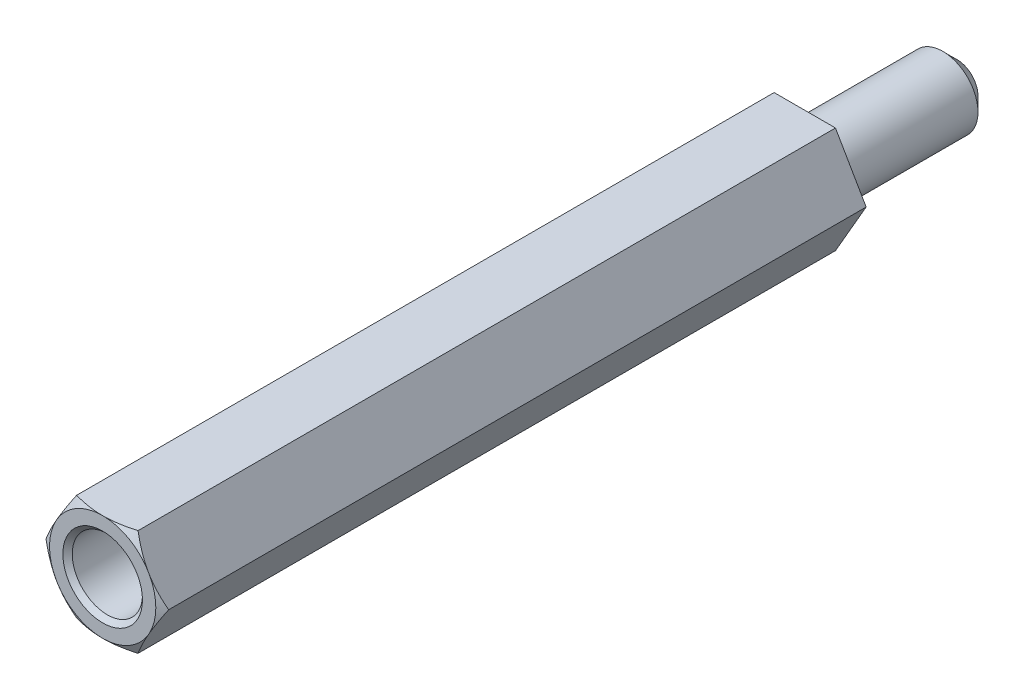
ISO-10303-21;
HEADER;
FILE_DESCRIPTION(('STEP AP214'),'2;1');
FILE_NAME('part.step','',(''),(''),'','','');
FILE_SCHEMA(('AUTOMOTIVE_DESIGN { 1 0 10303 214 1 1 1 1 }'));
ENDSEC;
DATA;
#1=APPLICATION_CONTEXT('core data for automotive mechanical design processes');
#2=APPLICATION_PROTOCOL_DEFINITION('international standard','automotive_design',2000,#1);
#3=PRODUCT_CONTEXT('',#1,'mechanical');
#4=PRODUCT('Part','Part','',(#3));
#5=PRODUCT_RELATED_PRODUCT_CATEGORY('part','',(#4));
#6=PRODUCT_DEFINITION_FORMATION('','',#4);
#7=PRODUCT_DEFINITION_CONTEXT('part definition',#1,'design');
#8=PRODUCT_DEFINITION('design','',#6,#7);
#9=PRODUCT_DEFINITION_SHAPE('','',#8);
#10=(LENGTH_UNIT() NAMED_UNIT(*) SI_UNIT(.MILLI.,.METRE.));
#11=(NAMED_UNIT(*) PLANE_ANGLE_UNIT() SI_UNIT($,.RADIAN.));
#12=(NAMED_UNIT(*) SI_UNIT($,.STERADIAN.) SOLID_ANGLE_UNIT());
#13=UNCERTAINTY_MEASURE_WITH_UNIT(LENGTH_MEASURE(1.E-05),#10,'distance_accuracy_value','');
#14=(GEOMETRIC_REPRESENTATION_CONTEXT(3) GLOBAL_UNCERTAINTY_ASSIGNED_CONTEXT((#13)) GLOBAL_UNIT_ASSIGNED_CONTEXT((#10,
#11,#12)) REPRESENTATION_CONTEXT('',''));
#15=CARTESIAN_POINT('',(0.,0.,0.));
#16=DIRECTION('',(0.,0.,1.));
#17=DIRECTION('',(1.,0.,0.));
#18=AXIS2_PLACEMENT_3D('',#15,#16,#17);
#19=CARTESIAN_POINT('',(0.,0.,30.));
#20=DIRECTION('',(0.,0.,1.));
#21=DIRECTION('',(1.,0.,0.));
#22=AXIS2_PLACEMENT_3D('',#19,#20,#21);
#23=PLANE('',#22);
#24=CARTESIAN_POINT('',(0.,0.,30.));
#25=DIRECTION('',(0.,0.,1.));
#26=DIRECTION('',(1.,0.,0.));
#27=AXIS2_PLACEMENT_3D('',#24,#25,#26);
#28=CIRCLE('',#27,1.7);
#29=CARTESIAN_POINT('',(1.7,0.,30.));
#30=VERTEX_POINT('',#29);
#31=EDGE_CURVE('E161',#30,#30,#28,.F.);
#32=ORIENTED_EDGE('',*,*,#31,.T.);
#33=EDGE_LOOP('',(#32));
#34=FACE_BOUND('',#33,.T.);
#35=CARTESIAN_POINT('',(0.,0.,30.));
#36=DIRECTION('',(0.,0.,1.));
#37=DIRECTION('',(1.,0.,0.));
#38=AXIS2_PLACEMENT_3D('',#35,#36,#37);
#39=CIRCLE('',#38,2.2711702221209);
#40=CARTESIAN_POINT('',(1.92942846272878,-1.19813187298426,30.));
#41=VERTEX_POINT('',#40);
#42=CARTESIAN_POINT('',(0.0728984077241233,-2.27,30.));
#43=VERTEX_POINT('',#42);
#44=EDGE_CURVE('E160',#41,#43,#39,.F.);
#45=ORIENTED_EDGE('',*,*,#44,.F.);
#46=DIRECTION('',(0.499999999999995,0.866025403784442,0.));
#47=VECTOR('',#46,1.);
#48=CARTESIAN_POINT('',(1.31058511106048,-2.26999999999999,30.));
#49=LINE('',#48,#47);
#50=CARTESIAN_POINT('',(2.0023268704526,-1.07186812701572,30.));
#51=VERTEX_POINT('',#50);
#52=EDGE_CURVE('E304',#41,#51,#49,.T.);
#53=ORIENTED_EDGE('',*,*,#52,.T.);
#54=CARTESIAN_POINT('',(2.00232687045273,1.07186812701549,30.));
#55=VERTEX_POINT('',#54);
#56=EDGE_CURVE('E157',#55,#51,#39,.F.);
#57=ORIENTED_EDGE('',*,*,#56,.F.);
#58=DIRECTION('',(-0.500000000000001,0.866025403784438,0.));
#59=VECTOR('',#58,1.);
#60=CARTESIAN_POINT('',(2.6211702221209,0.,30.));
#61=LINE('',#60,#59);
#62=CARTESIAN_POINT('',(1.92942846272862,1.19813187298452,30.));
#63=VERTEX_POINT('',#62);
#64=EDGE_CURVE('E316',#55,#63,#61,.T.);
#65=ORIENTED_EDGE('',*,*,#64,.T.);
#66=CARTESIAN_POINT('',(0.0728984077240917,2.27,30.));
#67=VERTEX_POINT('',#66);
#68=EDGE_CURVE('E159',#67,#63,#39,.F.);
#69=ORIENTED_EDGE('',*,*,#68,.F.);
#70=DIRECTION('',(-1.,0.,0.));
#71=VECTOR('',#70,1.);
#72=CARTESIAN_POINT('',(1.31058511106045,2.27,30.));
#73=LINE('',#72,#71);
#74=CARTESIAN_POINT('',(-0.0728984077241075,2.27,30.));
#75=VERTEX_POINT('',#74);
#76=EDGE_CURVE('E311',#67,#75,#73,.T.);
#77=ORIENTED_EDGE('',*,*,#76,.T.);
#78=CARTESIAN_POINT('',(-1.92942846272863,1.19813187298449,30.));
#79=VERTEX_POINT('',#78);
#80=EDGE_CURVE('E336',#79,#75,#39,.F.);
#81=ORIENTED_EDGE('',*,*,#80,.F.);
#82=DIRECTION('',(-0.499999999999995,-0.866025403784442,0.));
#83=VECTOR('',#82,1.);
#84=CARTESIAN_POINT('',(-1.31058511106046,2.27,30.));
#85=LINE('',#84,#83);
#86=CARTESIAN_POINT('',(-2.00232687045273,1.07186812701548,30.));
#87=VERTEX_POINT('',#86);
#88=EDGE_CURVE('E310',#79,#87,#85,.T.);
#89=ORIENTED_EDGE('',*,*,#88,.T.);
#90=CARTESIAN_POINT('',(-2.00232687045272,-1.0718681270155,30.));
#91=VERTEX_POINT('',#90);
#92=EDGE_CURVE('E121',#91,#87,#39,.F.);
#93=ORIENTED_EDGE('',*,*,#92,.F.);
#94=DIRECTION('',(0.500000000000007,-0.866025403784435,0.));
#95=VECTOR('',#94,1.);
#96=CARTESIAN_POINT('',(-2.6211702221209,0.,30.));
#97=LINE('',#96,#95);
#98=CARTESIAN_POINT('',(-1.92942846272861,-1.19813187298453,30.));
#99=VERTEX_POINT('',#98);
#100=EDGE_CURVE('E137',#91,#99,#97,.T.);
#101=ORIENTED_EDGE('',*,*,#100,.T.);
#102=CARTESIAN_POINT('',(-0.0728984077240759,-2.27,30.));
#103=VERTEX_POINT('',#102);
#104=EDGE_CURVE('E327',#103,#99,#39,.F.);
#105=ORIENTED_EDGE('',*,*,#104,.F.);
#106=DIRECTION('',(1.,0.,0.));
#107=VECTOR('',#106,1.);
#108=CARTESIAN_POINT('',(-1.31058511106043,-2.27000000000001,30.));
#109=LINE('',#108,#107);
#110=EDGE_CURVE('E296',#103,#43,#109,.T.);
#111=ORIENTED_EDGE('',*,*,#110,.T.);
#112=EDGE_LOOP('',(#45,#53,#57,#65,#69,#77,#81,#89,#93,#101,#105,#111));
#113=FACE_BOUND('',#112,.T.);
#114=ADVANCED_FACE('F32',(#34,#113),#23,.T.);
#115=CARTESIAN_POINT('',(1.31058511106048,-2.26999999999999,30.));
#116=DIRECTION('',(-0.866025403784442,0.499999999999995,0.));
#117=DIRECTION('',(-0.499999999999995,-0.866025403784442,0.));
#118=AXIS2_PLACEMENT_3D('',#115,#116,#117);
#119=PLANE('',#118);
#120=DIRECTION('',(0.,0.,-1.));
#121=VECTOR('',#120,1.);
#122=CARTESIAN_POINT('',(2.6211702221209,0.,30.));
#123=LINE('',#122,#121);
#124=CARTESIAN_POINT('',(2.6211702221209,0.,29.8));
#125=VERTEX_POINT('',#124);
#126=CARTESIAN_POINT('',(2.6211702221209,0.,0.));
#127=VERTEX_POINT('',#126);
#128=EDGE_CURVE('E155',#125,#127,#123,.T.);
#129=ORIENTED_EDGE('',*,*,#128,.F.);
#130=CARTESIAN_POINT('',(3.53192502802619,1.5774735970655,29.0874155357182));
#131=CARTESIAN_POINT('',(3.49038683177578,1.50552733070503,29.1258459368283));
#132=CARTESIAN_POINT('',(3.44875020540645,1.43341057837758,29.1638565423728));
#133=CARTESIAN_POINT('',(3.36523806633925,1.28876331046444,29.2388408708484));
#134=CARTESIAN_POINT('',(3.32336252393505,1.21623274342586,29.2758144613019));
#135=CARTESIAN_POINT('',(3.2392041639013,1.07046618796572,29.3486360571844));
#136=CARTESIAN_POINT('',(3.19692046373752,0.997228670950053,29.3844800017565));
#137=CARTESIAN_POINT('',(3.11203872815441,0.850209192285469,29.4546361454567));
#138=CARTESIAN_POINT('',(3.06944070287604,0.776427248201227,29.4889483937519));
#139=CARTESIAN_POINT('',(2.93902958582733,0.550548567601059,29.5907324723442));
#140=CARTESIAN_POINT('',(2.85063034563923,0.397436592244785,29.6552582519314));
#141=CARTESIAN_POINT('',(2.67192637782696,0.0879122404797767,29.7724545253547));
#142=CARTESIAN_POINT('',(2.58162393222904,-0.0684961833435607,29.8251384219436));
#143=CARTESIAN_POINT('',(2.42693241398783,-0.3364297524373,29.8992654299313));
#144=CARTESIAN_POINT('',(2.36310804900723,-0.446976795344526,29.9253337082215));
#145=CARTESIAN_POINT('',(2.23458545503781,-0.669584458020103,29.9666715963234));
#146=CARTESIAN_POINT('',(2.16988756118547,-0.781644497315057,29.9819452339838));
#147=CARTESIAN_POINT('',(2.04077595171338,-1.00527236476771,29.9998836306583));
#148=CARTESIAN_POINT('',(1.97636731130572,-1.11683140240021,30.0026891812466));
#149=CARTESIAN_POINT('',(1.84772217135019,-1.33965132095001,29.9957318097908));
#150=CARTESIAN_POINT('',(1.78348569252727,-1.45091216597063,29.9859674371621));
#151=CARTESIAN_POINT('',(1.63030365883246,-1.71623123113677,29.948841102754));
#152=CARTESIAN_POINT('',(1.54169424329176,-1.86970724088225,29.9160238630181));
#153=CARTESIAN_POINT('',(1.36642171508062,-2.173288164915,29.8337386865889));
#154=CARTESIAN_POINT('',(1.27976131396277,-2.32338838265541,29.7842489190442));
#155=CARTESIAN_POINT('',(1.10733311832963,-2.62204277814945,29.6734296043507));
#156=CARTESIAN_POINT('',(1.02158612689548,-2.77056092390956,29.6119739052285));
#157=CARTESIAN_POINT('',(0.85162252698669,-3.0649465143889,29.4814839194209));
#158=CARTESIAN_POINT('',(0.767405153907273,-3.21081528344244,29.4124535477672));
#159=CARTESIAN_POINT('',(0.635892107966398,-3.43860256087017,29.2999058489882));
#160=CARTESIAN_POINT('',(0.588222071353314,-3.52116948628271,29.258115008667));
#161=CARTESIAN_POINT('',(0.493605207664306,-3.68505070144489,29.1735241810497));
#162=CARTESIAN_POINT('',(0.446655700740952,-3.76636963282645,29.1307361997354));
#163=CARTESIAN_POINT('',(0.399830305155195,-3.84747359706549,29.0874155357182));
#164=B_SPLINE_CURVE_WITH_KNOTS('',3,(#130,#131,#132,#133,#134,#135,#136,#137,#138,#139,#140,
#141,#142,#143,#144,#145,#146,#147,#148,#149,#150,#151,#152,#153,#154,#155,#156,#157,#158,#159,
#160,#161,#162,#163),.UNSPECIFIED.,.F.,.F.,(4,2,2,2,2,2,2,2,2,2,2,2,2,2,2,2,4),(0.,
0.274606048832121,0.549247019939769,0.82478302101826,1.10031017110167,1.66467514911565,
2.22839812072206,2.61888273310893,3.00922156533175,3.39514124414463,3.78110546255825,
4.32061090335238,4.8608255310685,5.40707820220996,5.95304985633502,6.26533246804877,
6.57488685439787),.UNSPECIFIED.);
#165=EDGE_CURVE('E294',#125,#51,#164,.T.);
#166=ORIENTED_EDGE('',*,*,#165,.T.);
#167=ORIENTED_EDGE('',*,*,#52,.F.);
#168=CARTESIAN_POINT('',(1.31058511106048,-2.26999999999999,29.8));
#169=VERTEX_POINT('',#168);
#170=EDGE_CURVE('E138',#41,#169,#164,.T.);
#171=ORIENTED_EDGE('',*,*,#170,.T.);
#172=DIRECTION('',(0.,0.,-1.));
#173=VECTOR('',#172,1.);
#174=CARTESIAN_POINT('',(1.31058511106048,-2.26999999999999,30.));
#175=LINE('',#174,#173);
#176=CARTESIAN_POINT('',(1.31058511106048,-2.26999999999999,0.));
#177=VERTEX_POINT('',#176);
#178=EDGE_CURVE('E150',#169,#177,#175,.T.);
#179=ORIENTED_EDGE('',*,*,#178,.T.);
#180=DIRECTION('',(0.499999999999995,0.866025403784442,0.));
#181=VECTOR('',#180,1.);
#182=CARTESIAN_POINT('',(1.31058511106048,-2.26999999999999,0.));
#183=LINE('',#182,#181);
#184=EDGE_CURVE('E282',#177,#127,#183,.T.);
#185=ORIENTED_EDGE('',*,*,#184,.T.);
#186=EDGE_LOOP('',(#129,#166,#167,#171,#179,#185));
#187=FACE_BOUND('',#186,.T.);
#188=ADVANCED_FACE('F243',(#187),#119,.F.);
#189=CARTESIAN_POINT('',(2.6211702221209,0.,30.));
#190=DIRECTION('',(-0.866025403784438,-0.500000000000001,0.));
#191=DIRECTION('',(0.500000000000001,-0.866025403784438,0.));
#192=AXIS2_PLACEMENT_3D('',#189,#190,#191);
#193=PLANE('',#192);
#194=DIRECTION('',(0.,0.,-1.));
#195=VECTOR('',#194,1.);
#196=CARTESIAN_POINT('',(1.31058511106045,2.27,30.));
#197=LINE('',#196,#195);
#198=CARTESIAN_POINT('',(1.31058511106045,2.27,29.8));
#199=VERTEX_POINT('',#198);
#200=CARTESIAN_POINT('',(1.31058511106045,2.27,0.));
#201=VERTEX_POINT('',#200);
#202=EDGE_CURVE('E148',#199,#201,#197,.T.);
#203=ORIENTED_EDGE('',*,*,#202,.F.);
#204=CARTESIAN_POINT('',(0.399830305155137,3.84747359706553,29.0874155357182));
#205=CARTESIAN_POINT('',(0.441368501405547,3.77552733070505,29.1258459368283));
#206=CARTESIAN_POINT('',(0.483005127774877,3.70341057837761,29.1638565423728));
#207=CARTESIAN_POINT('',(0.566517266842073,3.55876331046447,29.2388408708484));
#208=CARTESIAN_POINT('',(0.608392809246276,3.48623274342588,29.2758144613019));
#209=CARTESIAN_POINT('',(0.692551169280029,3.34046618796575,29.3486360571844));
#210=CARTESIAN_POINT('',(0.734834869443806,3.26722867095008,29.3844800017564));
#211=CARTESIAN_POINT('',(0.819716605026922,3.1202091922855,29.4546361454567));
#212=CARTESIAN_POINT('',(0.862314630305293,3.04642724820126,29.4889483937519));
#213=CARTESIAN_POINT('',(0.992725747353997,2.82054856760109,29.5907324723442));
#214=CARTESIAN_POINT('',(1.0811249875421,2.66743659224481,29.6552582519314));
#215=CARTESIAN_POINT('',(1.25982895535437,2.35791224047981,29.7724545253547));
#216=CARTESIAN_POINT('',(1.3501314009523,2.20150381665647,29.8251384219436));
#217=CARTESIAN_POINT('',(1.50482291919351,1.93357024756273,29.8992654299313));
#218=CARTESIAN_POINT('',(1.56864728417411,1.82302320465551,29.9253337082215));
#219=CARTESIAN_POINT('',(1.69716987814353,1.60041554197993,29.9666715963234));
#220=CARTESIAN_POINT('',(1.76186777199587,1.48835550268498,29.9819452339838));
#221=CARTESIAN_POINT('',(1.89097938146796,1.26472763523233,29.9998836306583));
#222=CARTESIAN_POINT('',(1.95538802187562,1.15316859759983,30.0026891812466));
#223=CARTESIAN_POINT('',(2.08403316183115,0.930348679050028,29.9957318097908));
#224=CARTESIAN_POINT('',(2.14826964065407,0.819087834029409,29.9859674371621));
#225=CARTESIAN_POINT('',(2.30145167434888,0.553768768863274,29.9488411027541));
#226=CARTESIAN_POINT('',(2.39006108988958,0.400292759117802,29.9160238630181));
#227=CARTESIAN_POINT('',(2.56533361810072,0.0967118350850612,29.8337386865889));
#228=CARTESIAN_POINT('',(2.65199401921856,-0.053388382655342,29.7842489190442));
#229=CARTESIAN_POINT('',(2.8244222148517,-0.352042778149366,29.6734296043507));
#230=CARTESIAN_POINT('',(2.91016920628585,-0.500560923909474,29.6119739052286));
#231=CARTESIAN_POINT('',(3.08013280619464,-0.794946514388806,29.4814839194209));
#232=CARTESIAN_POINT('',(3.16435017927405,-0.940815283442336,29.4124535477672));
#233=CARTESIAN_POINT('',(3.29586322521494,-1.16860256087009,29.2999058489882));
#234=CARTESIAN_POINT('',(3.34353326182804,-1.25116948628265,29.258115008667));
#235=CARTESIAN_POINT('',(3.43815012551707,-1.41505070144488,29.1735241810497));
#236=CARTESIAN_POINT('',(3.48509963244044,-1.49636963282646,29.1307361997354));
#237=CARTESIAN_POINT('',(3.53192502802621,-1.57747359706552,29.0874155357182));
#238=B_SPLINE_CURVE_WITH_KNOTS('',3,(#204,#205,#206,#207,#208,#209,#210,#211,#212,#213,#214,
#215,#216,#217,#218,#219,#220,#221,#222,#223,#224,#225,#226,#227,#228,#229,#230,#231,#232,#233,
#234,#235,#236,#237),.UNSPECIFIED.,.F.,.F.,(4,2,2,2,2,2,2,2,2,2,2,2,2,2,2,2,4),(0.,
0.274606048832123,0.54924701993977,0.824783021018261,1.10031017110167,1.66467514911565,
2.22839812072207,2.61888273310893,3.00922156533176,3.39514124414464,3.78110546255825,
4.32061090335236,4.86082553106846,5.40707820220991,5.95304985633495,6.26533246804878,
6.57488685439797),.UNSPECIFIED.);
#239=EDGE_CURVE('E228',#199,#63,#238,.T.);
#240=ORIENTED_EDGE('',*,*,#239,.T.);
#241=ORIENTED_EDGE('',*,*,#64,.F.);
#242=EDGE_CURVE('E325',#55,#125,#238,.T.);
#243=ORIENTED_EDGE('',*,*,#242,.T.);
#244=ORIENTED_EDGE('',*,*,#128,.T.);
#245=DIRECTION('',(-0.500000000000001,0.866025403784438,0.));
#246=VECTOR('',#245,1.);
#247=CARTESIAN_POINT('',(2.6211702221209,0.,0.));
#248=LINE('',#247,#246);
#249=EDGE_CURVE('E287',#127,#201,#248,.T.);
#250=ORIENTED_EDGE('',*,*,#249,.T.);
#251=EDGE_LOOP('',(#203,#240,#241,#243,#244,#250));
#252=FACE_BOUND('',#251,.T.);
#253=ADVANCED_FACE('F238',(#252),#193,.F.);
#254=CARTESIAN_POINT('',(1.31058511106045,2.27,30.));
#255=DIRECTION('',(0.,-1.,0.));
#256=DIRECTION('',(1.,0.,0.));
#257=AXIS2_PLACEMENT_3D('',#254,#255,#256);
#258=PLANE('',#257);
#259=DIRECTION('',(0.,0.,-1.));
#260=VECTOR('',#259,1.);
#261=CARTESIAN_POINT('',(-1.31058511106046,2.27,30.));
#262=LINE('',#261,#260);
#263=CARTESIAN_POINT('',(-1.31058511106046,2.27,29.8));
#264=VERTEX_POINT('',#263);
#265=CARTESIAN_POINT('',(-1.31058511106046,2.27,0.));
#266=VERTEX_POINT('',#265);
#267=EDGE_CURVE('E145',#264,#266,#262,.T.);
#268=ORIENTED_EDGE('',*,*,#267,.F.);
#269=CARTESIAN_POINT('',(-2.88805870812598,2.26999999999999,29.1987324103344));
#270=CARTESIAN_POINT('',(-2.80547290408561,2.26999999999999,29.2358255324642));
#271=CARTESIAN_POINT('',(-2.72266390787582,2.26999999999999,29.2724300278097));
#272=CARTESIAN_POINT('',(-2.55650266128481,2.26999999999999,29.3444249566602));
#273=CARTESIAN_POINT('',(-2.47315031505662,2.26999999999999,29.3798151686687));
#274=CARTESIAN_POINT('',(-2.30548338672952,2.26999999999999,29.4492769222981));
#275=CARTESIAN_POINT('',(-2.22116623150815,2.26999999999999,29.4833422884396));
#276=CARTESIAN_POINT('',(-2.05182779905439,2.26999999999999,29.5496595457378));
#277=CARTESIAN_POINT('',(-1.96680655448942,2.26999999999999,29.5819115204949));
#278=CARTESIAN_POINT('',(-1.71138311857313,2.26999999999999,29.6750656041859));
#279=CARTESIAN_POINT('',(-1.53976972748373,2.26999999999999,29.7327268658694));
#280=CARTESIAN_POINT('',(-1.19280228070998,2.27,29.8349421604164));
#281=CARTESIAN_POINT('',(-1.01745424532612,2.27,29.879515794802));
#282=CARTESIAN_POINT('',(-0.71209077138909,2.27,29.9400719954737));
#283=CARTESIAN_POINT('',(-0.582987722953625,2.27,29.9605553386303));
#284=CARTESIAN_POINT('',(-0.323439084569055,2.27,29.989581233522));
#285=CARTESIAN_POINT('',(-0.192993977067347,2.27,29.9981279349084));
#286=CARTESIAN_POINT('',(0.0680599454393762,2.27,30.0022273630874));
#287=CARTESIAN_POINT('',(0.198668678458181,2.27,29.9977850727737));
#288=CARTESIAN_POINT('',(0.458851198221927,2.27,29.976485692699));
#289=CARTESIAN_POINT('',(0.588424742955677,2.27,29.9596257810572));
#290=CARTESIAN_POINT('',(0.904937752962719,2.27,29.9051607953018));
#291=CARTESIAN_POINT('',(1.09083477493521,2.27,29.8615794043185));
#292=CARTESIAN_POINT('',(1.36639728986909,2.27,29.7844964765957));
#293=CARTESIAN_POINT('',(1.45781153661096,2.27,29.7568102536344));
#294=CARTESIAN_POINT('',(1.63961899594481,2.27000000000001,29.6982591090532));
#295=CARTESIAN_POINT('',(1.73001229033944,2.27000000000001,29.6673944441364));
#296=CARTESIAN_POINT('',(1.91077257487061,2.27000000000001,29.6027837141474));
#297=CARTESIAN_POINT('',(2.00113026057096,2.27000000000001,29.5690119189924));
#298=CARTESIAN_POINT('',(2.18103313876788,2.27000000000001,29.499360278944));
#299=CARTESIAN_POINT('',(2.27057828364603,2.27000000000001,29.4634803114121));
#300=CARTESIAN_POINT('',(2.44846011178725,2.27000000000001,29.3902269588395));
#301=CARTESIAN_POINT('',(2.53680076536778,2.27000000000001,29.352863166806));
#302=CARTESIAN_POINT('',(2.71286376090329,2.27000000000001,29.2767584059864));
#303=CARTESIAN_POINT('',(2.80058623966965,2.27000000000001,29.2380177541729));
#304=CARTESIAN_POINT('',(2.88805870812597,2.27000000000001,29.1987324103344));
#305=B_SPLINE_CURVE_WITH_KNOTS('',3,(#269,#270,#271,#272,#273,#274,#275,#276,#277,#278,#279,
#280,#281,#282,#283,#284,#285,#286,#287,#288,#289,#290,#291,#292,#293,#294,#295,#296,#297,#298,
#299,#300,#301,#302,#303,#304),.UNSPECIFIED.,.F.,.F.,(4,2,2,2,2,2,2,2,2,2,2,2,2,2,2,2,2,4),(0.,
0.271603728461578,0.543256739373973,0.816052841064959,1.08883635604999,1.63163153509609,
2.17360956621752,2.5653004176683,2.95685506788359,3.34825952790363,3.73975296129818,
4.31141566486302,4.59793246001128,4.88442613310069,5.17378506531958,5.46316084709717,
5.75090015934329,6.03857365362724),.UNSPECIFIED.);
#306=EDGE_CURVE('E220',#264,#75,#305,.T.);
#307=ORIENTED_EDGE('',*,*,#306,.T.);
#308=ORIENTED_EDGE('',*,*,#76,.F.);
#309=EDGE_CURVE('E227',#67,#199,#305,.T.);
#310=ORIENTED_EDGE('',*,*,#309,.T.);
#311=ORIENTED_EDGE('',*,*,#202,.T.);
#312=DIRECTION('',(-1.,0.,0.));
#313=VECTOR('',#312,1.);
#314=CARTESIAN_POINT('',(1.31058511106045,2.27,0.));
#315=LINE('',#314,#313);
#316=EDGE_CURVE('E291',#201,#266,#315,.T.);
#317=ORIENTED_EDGE('',*,*,#316,.T.);
#318=EDGE_LOOP('',(#268,#307,#308,#310,#311,#317));
#319=FACE_BOUND('',#318,.T.);
#320=ADVANCED_FACE('F235',(#319),#258,.F.);
#321=CARTESIAN_POINT('',(-1.31058511106046,2.27,30.));
#322=DIRECTION('',(0.866025403784442,-0.499999999999995,0.));
#323=DIRECTION('',(0.499999999999995,0.866025403784442,0.));
#324=AXIS2_PLACEMENT_3D('',#321,#322,#323);
#325=PLANE('',#324);
#326=DIRECTION('',(0.,0.,-1.));
#327=VECTOR('',#326,1.);
#328=CARTESIAN_POINT('',(-2.6211702221209,0.,30.));
#329=LINE('',#328,#327);
#330=CARTESIAN_POINT('',(-2.6211702221209,0.,29.8));
#331=VERTEX_POINT('',#330);
#332=CARTESIAN_POINT('',(-2.6211702221209,0.,0.));
#333=VERTEX_POINT('',#332);
#334=EDGE_CURVE('E133',#331,#333,#329,.T.);
#335=ORIENTED_EDGE('',*,*,#334,.F.);
#336=CARTESIAN_POINT('',(-3.5319250280262,-1.57747359706554,29.0874155357182));
#337=CARTESIAN_POINT('',(-3.49038683177579,-1.50552733070506,29.1258459368283));
#338=CARTESIAN_POINT('',(-3.44875020540646,-1.43341057837762,29.1638565423728));
#339=CARTESIAN_POINT('',(-3.36523806633926,-1.28876331046448,29.2388408708484));
#340=CARTESIAN_POINT('',(-3.32336252393506,-1.2162327434259,29.2758144613019));
#341=CARTESIAN_POINT('',(-3.23920416390131,-1.07046618796576,29.3486360571844));
#342=CARTESIAN_POINT('',(-3.19692046373753,-0.997228670950092,29.3844800017564));
#343=CARTESIAN_POINT('',(-3.11203872815442,-0.850209192285508,29.4546361454567));
#344=CARTESIAN_POINT('',(-3.06944070287605,-0.776427248201265,29.4889483937519));
#345=CARTESIAN_POINT('',(-2.93902958582734,-0.550548567601098,29.5907324723442));
#346=CARTESIAN_POINT('',(-2.85063034563925,-0.397436592244824,29.6552582519314));
#347=CARTESIAN_POINT('',(-2.67192637782698,-0.0879122404798149,29.7724545253547));
#348=CARTESIAN_POINT('',(-2.58162393222905,0.0684961833435221,29.8251384219436));
#349=CARTESIAN_POINT('',(-2.42693241398784,0.336429752437261,29.8992654299313));
#350=CARTESIAN_POINT('',(-2.36310804900724,0.446976795344486,29.9253337082215));
#351=CARTESIAN_POINT('',(-2.23458545503782,0.669584458020063,29.9666715963234));
#352=CARTESIAN_POINT('',(-2.16988756118548,0.781644497315016,29.9819452339838));
#353=CARTESIAN_POINT('',(-2.0407759517134,1.00527236476767,29.9998836306583));
#354=CARTESIAN_POINT('',(-1.97636731130574,1.11683140240017,30.0026891812466));
#355=CARTESIAN_POINT('',(-1.8477221713502,1.33965132094997,29.9957318097908));
#356=CARTESIAN_POINT('',(-1.78348569252728,1.45091216597059,29.9859674371621));
#357=CARTESIAN_POINT('',(-1.63030365883247,1.71623123113672,29.9488411027541));
#358=CARTESIAN_POINT('',(-1.54169424329178,1.8697072408822,29.9160238630181));
#359=CARTESIAN_POINT('',(-1.36642171508064,2.17328816491494,29.8337386865889));
#360=CARTESIAN_POINT('',(-1.2797613139628,2.32338838265535,29.7842489190442));
#361=CARTESIAN_POINT('',(-1.10733311832966,2.62204277814937,29.6734296043507));
#362=CARTESIAN_POINT('',(-1.02158612689552,2.77056092390948,29.6119739052286));
#363=CARTESIAN_POINT('',(-0.851622526986728,3.06494651438882,29.4814839194209));
#364=CARTESIAN_POINT('',(-0.767405153907314,3.21081528344235,29.4124535477672));
#365=CARTESIAN_POINT('',(-0.635892107966429,3.4386025608701,29.2999058489882));
#366=CARTESIAN_POINT('',(-0.588222071353332,3.52116948628266,29.258115008667));
#367=CARTESIAN_POINT('',(-0.4936052076643,3.68505070144488,29.1735241810497));
#368=CARTESIAN_POINT('',(-0.446655700740935,3.76636963282646,29.1307361997354));
#369=CARTESIAN_POINT('',(-0.399830305155167,3.84747359706552,29.0874155357182));
#370=B_SPLINE_CURVE_WITH_KNOTS('',3,(#336,#337,#338,#339,#340,#341,#342,#343,#344,#345,#346,
#347,#348,#349,#350,#351,#352,#353,#354,#355,#356,#357,#358,#359,#360,#361,#362,#363,#364,#365,
#366,#367,#368,#369),.UNSPECIFIED.,.F.,.F.,(4,2,2,2,2,2,2,2,2,2,2,2,2,2,2,2,4),(0.,
0.274606048832123,0.54924701993977,0.82478302101826,1.10031017110167,1.66467514911565,
2.22839812072206,2.61888273310893,3.00922156533175,3.39514124414463,3.78110546255824,
4.32061090335236,4.86082553106847,5.40707820220992,5.95304985633496,6.26533246804878,
6.57488685439796),.UNSPECIFIED.);
#371=EDGE_CURVE('E119',#331,#87,#370,.T.);
#372=ORIENTED_EDGE('',*,*,#371,.T.);
#373=ORIENTED_EDGE('',*,*,#88,.F.);
#374=EDGE_CURVE('E126',#79,#264,#370,.T.);
#375=ORIENTED_EDGE('',*,*,#374,.T.);
#376=ORIENTED_EDGE('',*,*,#267,.T.);
#377=DIRECTION('',(-0.499999999999995,-0.866025403784442,0.));
#378=VECTOR('',#377,1.);
#379=CARTESIAN_POINT('',(-1.31058511106046,2.27,0.));
#380=LINE('',#379,#378);
#381=EDGE_CURVE('E143',#266,#333,#380,.T.);
#382=ORIENTED_EDGE('',*,*,#381,.T.);
#383=EDGE_LOOP('',(#335,#372,#373,#375,#376,#382));
#384=FACE_BOUND('',#383,.T.);
#385=ADVANCED_FACE('F141',(#384),#325,.F.);
#386=CARTESIAN_POINT('',(-2.6211702221209,0.,30.));
#387=DIRECTION('',(0.866025403784435,0.500000000000007,0.));
#388=DIRECTION('',(-0.500000000000007,0.866025403784435,0.));
#389=AXIS2_PLACEMENT_3D('',#386,#387,#388);
#390=PLANE('',#389);
#391=DIRECTION('',(0.,0.,-1.));
#392=VECTOR('',#391,1.);
#393=CARTESIAN_POINT('',(-1.31058511106043,-2.27000000000001,30.));
#394=LINE('',#393,#392);
#395=CARTESIAN_POINT('',(-1.31058511106043,-2.27000000000001,29.8));
#396=VERTEX_POINT('',#395);
#397=CARTESIAN_POINT('',(-1.31058511106043,-2.27000000000001,0.));
#398=VERTEX_POINT('',#397);
#399=EDGE_CURVE('E146',#396,#398,#394,.T.);
#400=ORIENTED_EDGE('',*,*,#399,.F.);
#401=CARTESIAN_POINT('',(-0.399830305155106,-3.84747359706554,29.0874155357182));
#402=CARTESIAN_POINT('',(-0.441368501405517,-3.77552733070506,29.1258459368283));
#403=CARTESIAN_POINT('',(-0.483005127774848,-3.70341057837762,29.1638565423728));
#404=CARTESIAN_POINT('',(-0.566517266842045,-3.55876331046448,29.2388408708484));
#405=CARTESIAN_POINT('',(-0.608392809246248,-3.4862327434259,29.2758144613019));
#406=CARTESIAN_POINT('',(-0.692551169280002,-3.34046618796576,29.3486360571844));
#407=CARTESIAN_POINT('',(-0.734834869443779,-3.26722867095009,29.3844800017564));
#408=CARTESIAN_POINT('',(-0.819716605026896,-3.12020919228551,29.4546361454567));
#409=CARTESIAN_POINT('',(-0.862314630305267,-3.04642724820127,29.4889483937519));
#410=CARTESIAN_POINT('',(-0.992725747353973,-2.8205485676011,29.5907324723442));
#411=CARTESIAN_POINT('',(-1.08112498754207,-2.66743659224483,29.6552582519314));
#412=CARTESIAN_POINT('',(-1.25982895535435,-2.35791224047982,29.7724545253547));
#413=CARTESIAN_POINT('',(-1.35013140095228,-2.20150381665649,29.8251384219436));
#414=CARTESIAN_POINT('',(-1.50482291919349,-1.93357024756275,29.8992654299313));
#415=CARTESIAN_POINT('',(-1.56864728417409,-1.82302320465552,29.9253337082215));
#416=CARTESIAN_POINT('',(-1.69716987814351,-1.60041554197995,29.9666715963234));
#417=CARTESIAN_POINT('',(-1.76186777199585,-1.488355502685,29.9819452339838));
#418=CARTESIAN_POINT('',(-1.89097938146795,-1.26472763523235,29.9998836306583));
#419=CARTESIAN_POINT('',(-1.9553880218756,-1.15316859759985,30.0026891812466));
#420=CARTESIAN_POINT('',(-2.08403316183115,-0.930348679050048,29.9957318097908));
#421=CARTESIAN_POINT('',(-2.14826964065407,-0.81908783402943,29.9859674371621));
#422=CARTESIAN_POINT('',(-2.30145167434888,-0.553768768863296,29.9488411027541));
#423=CARTESIAN_POINT('',(-2.39006108988957,-0.400292759117825,29.9160238630181));
#424=CARTESIAN_POINT('',(-2.56533361810071,-0.0967118350850867,29.8337386865889));
#425=CARTESIAN_POINT('',(-2.65199401921856,0.0533883826553158,29.7842489190442));
#426=CARTESIAN_POINT('',(-2.8244222148517,0.352042778149338,29.6734296043507));
#427=CARTESIAN_POINT('',(-2.91016920628584,0.500560923909445,29.6119739052286));
#428=CARTESIAN_POINT('',(-3.08013280619464,0.794946514388775,29.4814839194209));
#429=CARTESIAN_POINT('',(-3.16435017927405,0.940815283442304,29.4124535477672));
#430=CARTESIAN_POINT('',(-3.29586322521494,1.16860256087006,29.2999058489882));
#431=CARTESIAN_POINT('',(-3.34353326182804,1.25116948628262,29.258115008667));
#432=CARTESIAN_POINT('',(-3.43815012551708,1.41505070144485,29.1735241810497));
#433=CARTESIAN_POINT('',(-3.48509963244045,1.49636963282644,29.1307361997354));
#434=CARTESIAN_POINT('',(-3.53192502802623,1.5774735970655,29.0874155357182));
#435=B_SPLINE_CURVE_WITH_KNOTS('',3,(#401,#402,#403,#404,#405,#406,#407,#408,#409,#410,#411,
#412,#413,#414,#415,#416,#417,#418,#419,#420,#421,#422,#423,#424,#425,#426,#427,#428,#429,#430,
#431,#432,#433,#434),.UNSPECIFIED.,.F.,.F.,(4,2,2,2,2,2,2,2,2,2,2,2,2,2,2,2,4),(0.,
0.274606048832121,0.54924701993977,0.824783021018259,1.10031017110167,1.66467514911565,
2.22839812072207,2.61888273310893,3.00922156533176,3.39514124414464,3.78110546255825,
4.32061090335236,4.86082553106846,5.40707820220991,5.95304985633495,6.26533246804879,
6.57488685439799),.UNSPECIFIED.);
#436=EDGE_CURVE('E140',#396,#99,#435,.T.);
#437=ORIENTED_EDGE('',*,*,#436,.T.);
#438=ORIENTED_EDGE('',*,*,#100,.F.);
#439=EDGE_CURVE('E55',#91,#331,#435,.T.);
#440=ORIENTED_EDGE('',*,*,#439,.T.);
#441=ORIENTED_EDGE('',*,*,#334,.T.);
#442=DIRECTION('',(0.500000000000007,-0.866025403784435,0.));
#443=VECTOR('',#442,1.);
#444=CARTESIAN_POINT('',(-2.6211702221209,0.,0.));
#445=LINE('',#444,#443);
#446=EDGE_CURVE('E302',#333,#398,#445,.T.);
#447=ORIENTED_EDGE('',*,*,#446,.T.);
#448=EDGE_LOOP('',(#400,#437,#438,#440,#441,#447));
#449=FACE_BOUND('',#448,.T.);
#450=ADVANCED_FACE('F131',(#449),#390,.F.);
#451=CARTESIAN_POINT('',(-1.31058511106043,-2.27000000000001,30.));
#452=DIRECTION('',(0.,1.,0.));
#453=DIRECTION('',(-1.,0.,0.));
#454=AXIS2_PLACEMENT_3D('',#451,#452,#453);
#455=PLANE('',#454);
#456=ORIENTED_EDGE('',*,*,#178,.F.);
#457=CARTESIAN_POINT('',(2.888058708126,-2.26999999999997,29.1987324103344));
#458=CARTESIAN_POINT('',(2.80547290408563,-2.26999999999997,29.2358255324642));
#459=CARTESIAN_POINT('',(2.72266390787583,-2.26999999999997,29.2724300278097));
#460=CARTESIAN_POINT('',(2.55650266128482,-2.26999999999997,29.3444249566602));
#461=CARTESIAN_POINT('',(2.47315031505664,-2.26999999999997,29.3798151686687));
#462=CARTESIAN_POINT('',(2.30548338672954,-2.26999999999998,29.4492769222981));
#463=CARTESIAN_POINT('',(2.22116623150817,-2.26999999999998,29.4833422884396));
#464=CARTESIAN_POINT('',(2.05182779905441,-2.26999999999998,29.5496595457378));
#465=CARTESIAN_POINT('',(1.96680655448943,-2.26999999999998,29.5819115204949));
#466=CARTESIAN_POINT('',(1.71138311857314,-2.26999999999998,29.6750656041859));
#467=CARTESIAN_POINT('',(1.53976972748375,-2.26999999999998,29.7327268658694));
#468=CARTESIAN_POINT('',(1.19280228071,-2.26999999999999,29.8349421604164));
#469=CARTESIAN_POINT('',(1.01745424532613,-2.26999999999999,29.879515794802));
#470=CARTESIAN_POINT('',(0.712090771389104,-2.26999999999999,29.9400719954737));
#471=CARTESIAN_POINT('',(0.582987722953639,-2.26999999999999,29.9605553386303));
#472=CARTESIAN_POINT('',(0.323439084569069,-2.27,29.989581233522));
#473=CARTESIAN_POINT('',(0.19299397706736,-2.27,29.9981279349084));
#474=CARTESIAN_POINT('',(-0.0680599454393634,-2.27,30.0022273630874));
#475=CARTESIAN_POINT('',(-0.198668678458168,-2.27,29.9977850727737));
#476=CARTESIAN_POINT('',(-0.458851198221915,-2.27,29.976485692699));
#477=CARTESIAN_POINT('',(-0.588424742955665,-2.27000000000001,29.9596257810572));
#478=CARTESIAN_POINT('',(-0.904937752962707,-2.27000000000001,29.9051607953018));
#479=CARTESIAN_POINT('',(-1.0908347749352,-2.27000000000001,29.8615794043185));
#480=CARTESIAN_POINT('',(-1.36639728986908,-2.27000000000001,29.7844964765957));
#481=CARTESIAN_POINT('',(-1.45781153661095,-2.27000000000002,29.7568102536344));
#482=CARTESIAN_POINT('',(-1.63961899594479,-2.27000000000002,29.6982591090532));
#483=CARTESIAN_POINT('',(-1.73001229033943,-2.27000000000002,29.6673944441364));
#484=CARTESIAN_POINT('',(-1.91077257487059,-2.27000000000002,29.6027837141474));
#485=CARTESIAN_POINT('',(-2.00113026057095,-2.27000000000002,29.5690119189924));
#486=CARTESIAN_POINT('',(-2.18103313876786,-2.27000000000002,29.499360278944));
#487=CARTESIAN_POINT('',(-2.27057828364602,-2.27000000000002,29.4634803114121));
#488=CARTESIAN_POINT('',(-2.44846011178724,-2.27000000000003,29.3902269588395));
#489=CARTESIAN_POINT('',(-2.53680076536777,-2.27000000000003,29.352863166806));
#490=CARTESIAN_POINT('',(-2.71286376090327,-2.27000000000003,29.2767584059864));
#491=CARTESIAN_POINT('',(-2.80058623966963,-2.27000000000003,29.2380177541729));
#492=CARTESIAN_POINT('',(-2.88805870812595,-2.27000000000003,29.1987324103344));
#493=B_SPLINE_CURVE_WITH_KNOTS('',3,(#457,#458,#459,#460,#461,#462,#463,#464,#465,#466,#467,
#468,#469,#470,#471,#472,#473,#474,#475,#476,#477,#478,#479,#480,#481,#482,#483,#484,#485,#486,
#487,#488,#489,#490,#491,#492),.UNSPECIFIED.,.F.,.F.,(4,2,2,2,2,2,2,2,2,2,2,2,2,2,2,2,2,4),(0.,
0.271603728461578,0.543256739373973,0.816052841064959,1.08883635604999,1.63163153509609,
2.17360956621752,2.5653004176683,2.95685506788359,3.34825952790363,3.73975296129818,
4.31141566486302,4.59793246001128,4.88442613310069,5.17378506531958,5.46316084709716,
5.75090015934329,6.03857365362724),.UNSPECIFIED.);
#494=EDGE_CURVE('E181',#169,#43,#493,.T.);
#495=ORIENTED_EDGE('',*,*,#494,.T.);
#496=ORIENTED_EDGE('',*,*,#110,.F.);
#497=EDGE_CURVE('E47',#103,#396,#493,.T.);
#498=ORIENTED_EDGE('',*,*,#497,.T.);
#499=ORIENTED_EDGE('',*,*,#399,.T.);
#500=DIRECTION('',(1.,0.,0.));
#501=VECTOR('',#500,1.);
#502=CARTESIAN_POINT('',(-1.31058511106043,-2.27000000000001,0.));
#503=LINE('',#502,#501);
#504=EDGE_CURVE('E284',#398,#177,#503,.T.);
#505=ORIENTED_EDGE('',*,*,#504,.T.);
#506=EDGE_LOOP('',(#456,#495,#496,#498,#499,#505));
#507=FACE_BOUND('',#506,.T.);
#508=ADVANCED_FACE('F188',(#507),#455,.F.);
#509=CARTESIAN_POINT('',(0.,0.,0.));
#510=DIRECTION('',(0.,0.,1.));
#511=DIRECTION('',(1.,0.,0.));
#512=AXIS2_PLACEMENT_3D('',#509,#510,#511);
#513=PLANE('',#512);
#514=CARTESIAN_POINT('',(0.,0.,0.));
#515=DIRECTION('',(0.,0.,-1.));
#516=DIRECTION('',(-1.,0.,0.));
#517=AXIS2_PLACEMENT_3D('',#514,#515,#516);
#518=CIRCLE('',#517,1.5);
#519=CARTESIAN_POINT('',(1.5,0.,0.));
#520=VERTEX_POINT('',#519);
#521=EDGE_CURVE('E166',#520,#520,#518,.T.);
#522=ORIENTED_EDGE('',*,*,#521,.F.);
#523=EDGE_LOOP('',(#522));
#524=FACE_BOUND('',#523,.T.);
#525=ORIENTED_EDGE('',*,*,#184,.F.);
#526=ORIENTED_EDGE('',*,*,#504,.F.);
#527=ORIENTED_EDGE('',*,*,#446,.F.);
#528=ORIENTED_EDGE('',*,*,#381,.F.);
#529=ORIENTED_EDGE('',*,*,#316,.F.);
#530=ORIENTED_EDGE('',*,*,#249,.F.);
#531=EDGE_LOOP('',(#525,#526,#527,#528,#529,#530));
#532=FACE_BOUND('',#531,.T.);
#533=ADVANCED_FACE('F268',(#524,#532),#513,.F.);
#534=CARTESIAN_POINT('',(0.,0.,30.000012));
#535=DIRECTION('',(0.,0.,-1.));
#536=DIRECTION('',(-1.,0.,0.));
#537=AXIS2_PLACEMENT_3D('',#534,#535,#536);
#538=CYLINDRICAL_SURFACE('',#537,1.5);
#539=CARTESIAN_POINT('',(0.,0.,29.8));
#540=DIRECTION('',(0.,0.,1.));
#541=DIRECTION('',(1.,0.,0.));
#542=AXIS2_PLACEMENT_3D('',#539,#540,#541);
#543=CIRCLE('',#542,1.5);
#544=CARTESIAN_POINT('',(-1.5,0.,29.8));
#545=VERTEX_POINT('',#544);
#546=EDGE_CURVE('E164',#545,#545,#543,.T.);
#547=CARTESIAN_POINT('',(0.,0.,18.));
#548=DIRECTION('',(0.,0.,1.));
#549=DIRECTION('',(1.,0.,0.));
#550=AXIS2_PLACEMENT_3D('',#547,#548,#549);
#551=CIRCLE('',#550,1.5);
#552=CARTESIAN_POINT('',(-1.5,0.,18.));
#553=VERTEX_POINT('',#552);
#554=EDGE_CURVE('E289',#553,#553,#551,.T.);
#555=CARTESIAN_POINT('',(-1.5,0.,29.8));
#556=CARTESIAN_POINT('',(-1.5,0.,29.6770833333333));
#557=CARTESIAN_POINT('',(-1.5,0.,29.5541666666667));
#558=CARTESIAN_POINT('',(-1.5,0.,29.3083333333333));
#559=CARTESIAN_POINT('',(-1.5,0.,29.1854166666667));
#560=CARTESIAN_POINT('',(-1.5,0.,28.9395833333333));
#561=CARTESIAN_POINT('',(-1.5,0.,28.8166666666667));
#562=CARTESIAN_POINT('',(-1.5,0.,28.5708333333333));
#563=CARTESIAN_POINT('',(-1.5,0.,28.4479166666667));
#564=CARTESIAN_POINT('',(-1.5,0.,28.2020833333333));
#565=CARTESIAN_POINT('',(-1.5,0.,28.0791666666667));
#566=CARTESIAN_POINT('',(-1.5,0.,27.8333333333333));
#567=CARTESIAN_POINT('',(-1.5,0.,27.7104166666667));
#568=CARTESIAN_POINT('',(-1.5,0.,27.4645833333333));
#569=CARTESIAN_POINT('',(-1.5,0.,27.3416666666667));
#570=CARTESIAN_POINT('',(-1.5,0.,27.0958333333333));
#571=CARTESIAN_POINT('',(-1.5,0.,26.9729166666667));
#572=CARTESIAN_POINT('',(-1.5,0.,26.7270833333333));
#573=CARTESIAN_POINT('',(-1.5,0.,26.6041666666667));
#574=CARTESIAN_POINT('',(-1.5,0.,26.3583333333333));
#575=CARTESIAN_POINT('',(-1.5,0.,26.2354166666667));
#576=CARTESIAN_POINT('',(-1.5,0.,25.9895833333333));
#577=CARTESIAN_POINT('',(-1.5,0.,25.8666666666667));
#578=CARTESIAN_POINT('',(-1.5,0.,25.6208333333333));
#579=CARTESIAN_POINT('',(-1.5,0.,25.4979166666667));
#580=CARTESIAN_POINT('',(-1.5,0.,25.2520833333333));
#581=CARTESIAN_POINT('',(-1.5,0.,25.1291666666667));
#582=CARTESIAN_POINT('',(-1.5,0.,24.8833333333333));
#583=CARTESIAN_POINT('',(-1.5,0.,24.7604166666667));
#584=CARTESIAN_POINT('',(-1.5,0.,24.5145833333333));
#585=CARTESIAN_POINT('',(-1.5,0.,24.3916666666667));
#586=CARTESIAN_POINT('',(-1.5,0.,24.1458333333333));
#587=CARTESIAN_POINT('',(-1.5,0.,24.0229166666667));
#588=CARTESIAN_POINT('',(-1.5,0.,23.7770833333333));
#589=CARTESIAN_POINT('',(-1.5,0.,23.6541666666667));
#590=CARTESIAN_POINT('',(-1.5,0.,23.4083333333333));
#591=CARTESIAN_POINT('',(-1.5,0.,23.2854166666667));
#592=CARTESIAN_POINT('',(-1.5,0.,23.0395833333333));
#593=CARTESIAN_POINT('',(-1.5,0.,22.9166666666667));
#594=CARTESIAN_POINT('',(-1.5,0.,22.6708333333333));
#595=CARTESIAN_POINT('',(-1.5,0.,22.5479166666667));
#596=CARTESIAN_POINT('',(-1.5,0.,22.3020833333333));
#597=CARTESIAN_POINT('',(-1.5,0.,22.1791666666667));
#598=CARTESIAN_POINT('',(-1.5,0.,21.9333333333333));
#599=CARTESIAN_POINT('',(-1.5,0.,21.8104166666667));
#600=CARTESIAN_POINT('',(-1.5,0.,21.5645833333333));
#601=CARTESIAN_POINT('',(-1.5,0.,21.4416666666667));
#602=CARTESIAN_POINT('',(-1.5,0.,21.1958333333333));
#603=CARTESIAN_POINT('',(-1.5,0.,21.0729166666667));
#604=CARTESIAN_POINT('',(-1.5,0.,20.8270833333333));
#605=CARTESIAN_POINT('',(-1.5,0.,20.7041666666667));
#606=CARTESIAN_POINT('',(-1.5,0.,20.4583333333333));
#607=CARTESIAN_POINT('',(-1.5,0.,20.3354166666667));
#608=CARTESIAN_POINT('',(-1.5,0.,20.0895833333333));
#609=CARTESIAN_POINT('',(-1.5,0.,19.9666666666667));
#610=CARTESIAN_POINT('',(-1.5,0.,19.7208333333333));
#611=CARTESIAN_POINT('',(-1.5,0.,19.5979166666667));
#612=CARTESIAN_POINT('',(-1.5,0.,19.3520833333333));
#613=CARTESIAN_POINT('',(-1.5,0.,19.2291666666667));
#614=CARTESIAN_POINT('',(-1.5,0.,18.9833333333333));
#615=CARTESIAN_POINT('',(-1.5,0.,18.8604166666667));
#616=CARTESIAN_POINT('',(-1.5,0.,18.6145833333333));
#617=CARTESIAN_POINT('',(-1.5,0.,18.4916666666667));
#618=CARTESIAN_POINT('',(-1.5,0.,18.2458333333333));
#619=CARTESIAN_POINT('',(-1.5,0.,18.1229166666667));
#620=CARTESIAN_POINT('',(-1.5,0.,18.));
#621=B_SPLINE_CURVE_WITH_KNOTS('',3,(#555,#556,#557,#558,#559,#560,#561,#562,#563,#564,#565,
#566,#567,#568,#569,#570,#571,#572,#573,#574,#575,#576,#577,#578,#579,#580,#581,#582,#583,#584,
#585,#586,#587,#588,#589,#590,#591,#592,#593,#594,#595,#596,#597,#598,#599,#600,#601,#602,#603,
#604,#605,#606,#607,#608,#609,#610,#611,#612,#613,#614,#615,#616,#617,#618,#619,#620),
.UNSPECIFIED.,.F.,.F.,(4,2,2,2,2,2,2,2,2,2,2,2,2,2,2,2,2,2,2,2,2,2,2,2,2,2,2,2,2,2,2,2,4),(0.,
0.368750000000001,0.737500000000002,1.10625,1.475,1.84375,2.2125,2.58125,2.95,3.31875,3.6875,
4.05625,4.425,4.79375,5.1625,5.53125,5.9,6.26875,6.6375,7.00625,7.375,7.74375,8.1125,8.48125,
8.85,9.21875,9.5875,9.95625,10.325,10.69375,11.0625,11.43125,11.8),.UNSPECIFIED.);
#622=EDGE_CURVE('BSEAM267',#545,#553,#621,.T.);
#623=ORIENTED_EDGE('',*,*,#546,.T.);
#624=ORIENTED_EDGE('',*,*,#554,.F.);
#625=ORIENTED_EDGE('',*,*,#622,.T.);
#626=ORIENTED_EDGE('',*,*,#622,.F.);
#627=EDGE_LOOP('',(#623,#625,#624,#626));
#628=FACE_BOUND('',#627,.T.);
#629=ADVANCED_FACE('F267',(#628),#538,.F.);
#630=CARTESIAN_POINT('',(0.,0.,18.));
#631=DIRECTION('',(0.,0.,1.));
#632=DIRECTION('',(1.,0.,0.));
#633=AXIS2_PLACEMENT_3D('',#630,#631,#632);
#634=PLANE('',#633);
#635=ORIENTED_EDGE('',*,*,#554,.T.);
#636=EDGE_LOOP('',(#635));
#637=FACE_BOUND('',#636,.T.);
#638=ADVANCED_FACE('F197',(#637),#634,.T.);
#639=CARTESIAN_POINT('',(0.,0.,30.));
#640=DIRECTION('',(0.,0.,-1.));
#641=DIRECTION('',(-1.,0.,0.));
#642=AXIS2_PLACEMENT_3D('',#639,#640,#641);
#643=CONICAL_SURFACE('',#642,2.2711702221209,1.05165021254838);
#644=ORIENTED_EDGE('',*,*,#242,.F.);
#645=ORIENTED_EDGE('',*,*,#56,.T.);
#646=ORIENTED_EDGE('',*,*,#165,.F.);
#647=EDGE_LOOP('',(#644,#645,#646));
#648=FACE_BOUND('',#647,.T.);
#649=ADVANCED_FACE('F191',(#648),#643,.T.);
#650=ORIENTED_EDGE('',*,*,#309,.F.);
#651=ORIENTED_EDGE('',*,*,#68,.T.);
#652=ORIENTED_EDGE('',*,*,#239,.F.);
#653=EDGE_LOOP('',(#650,#651,#652));
#654=FACE_BOUND('',#653,.T.);
#655=ADVANCED_FACE('F196',(#654),#643,.T.);
#656=ORIENTED_EDGE('',*,*,#374,.F.);
#657=ORIENTED_EDGE('',*,*,#80,.T.);
#658=ORIENTED_EDGE('',*,*,#306,.F.);
#659=EDGE_LOOP('',(#656,#657,#658));
#660=FACE_BOUND('',#659,.T.);
#661=ADVANCED_FACE('F339',(#660),#643,.T.);
#662=ORIENTED_EDGE('',*,*,#439,.F.);
#663=ORIENTED_EDGE('',*,*,#92,.T.);
#664=ORIENTED_EDGE('',*,*,#371,.F.);
#665=EDGE_LOOP('',(#662,#663,#664));
#666=FACE_BOUND('',#665,.T.);
#667=ADVANCED_FACE('F120',(#666),#643,.T.);
#668=ORIENTED_EDGE('',*,*,#497,.F.);
#669=ORIENTED_EDGE('',*,*,#104,.T.);
#670=ORIENTED_EDGE('',*,*,#436,.F.);
#671=EDGE_LOOP('',(#668,#669,#670));
#672=FACE_BOUND('',#671,.T.);
#673=ADVANCED_FACE('F199',(#672),#643,.T.);
#674=ORIENTED_EDGE('',*,*,#44,.T.);
#675=ORIENTED_EDGE('',*,*,#494,.F.);
#676=ORIENTED_EDGE('',*,*,#170,.F.);
#677=EDGE_LOOP('',(#674,#675,#676));
#678=FACE_BOUND('',#677,.T.);
#679=ADVANCED_FACE('F250',(#678),#643,.T.);
#680=CARTESIAN_POINT('',(0.,0.,30.));
#681=DIRECTION('',(0.,0.,1.));
#682=DIRECTION('',(1.,0.,0.));
#683=AXIS2_PLACEMENT_3D('',#680,#681,#682);
#684=CONICAL_SURFACE('',#683,1.7,0.785398163397446);
#685=ORIENTED_EDGE('',*,*,#546,.F.);
#686=EDGE_LOOP('',(#685));
#687=FACE_BOUND('',#686,.T.);
#688=ORIENTED_EDGE('',*,*,#31,.F.);
#689=EDGE_LOOP('',(#688));
#690=FACE_BOUND('',#689,.T.);
#691=ADVANCED_FACE('F248',(#687,#690),#684,.F.);
#692=CARTESIAN_POINT('',(0.,0.,-6.5));
#693=DIRECTION('',(0.,0.,1.));
#694=DIRECTION('',(1.,0.,0.));
#695=AXIS2_PLACEMENT_3D('',#692,#693,#694);
#696=CYLINDRICAL_SURFACE('',#695,1.5);
#697=CARTESIAN_POINT('',(0.,0.,-5.90000000000001));
#698=DIRECTION('',(0.,0.,-1.));
#699=DIRECTION('',(-1.,0.,0.));
#700=AXIS2_PLACEMENT_3D('',#697,#698,#699);
#701=CIRCLE('',#700,1.5);
#702=CARTESIAN_POINT('',(1.5,0.,-5.90000000000001));
#703=VERTEX_POINT('',#702);
#704=EDGE_CURVE('E11',#703,#703,#701,.F.);
#705=CARTESIAN_POINT('',(1.5,0.,-5.90000000000001));
#706=CARTESIAN_POINT('',(1.5,0.,-5.83854166666668));
#707=CARTESIAN_POINT('',(1.5,0.,-5.77708333333335));
#708=CARTESIAN_POINT('',(1.5,0.,-5.65416666666668));
#709=CARTESIAN_POINT('',(1.5,0.,-5.59270833333334));
#710=CARTESIAN_POINT('',(1.5,0.,-5.46979166666668));
#711=CARTESIAN_POINT('',(1.5,0.,-5.40833333333334));
#712=CARTESIAN_POINT('',(1.5,0.,-5.28541666666668));
#713=CARTESIAN_POINT('',(1.5,0.,-5.22395833333334));
#714=CARTESIAN_POINT('',(1.5,0.,-5.10104166666668));
#715=CARTESIAN_POINT('',(1.5,0.,-5.03958333333334));
#716=CARTESIAN_POINT('',(1.5,0.,-4.91666666666668));
#717=CARTESIAN_POINT('',(1.5,0.,-4.85520833333334));
#718=CARTESIAN_POINT('',(1.5,0.,-4.73229166666668));
#719=CARTESIAN_POINT('',(1.5,0.,-4.67083333333334));
#720=CARTESIAN_POINT('',(1.5,0.,-4.54791666666668));
#721=CARTESIAN_POINT('',(1.5,0.,-4.48645833333334));
#722=CARTESIAN_POINT('',(1.5,0.,-4.36354166666668));
#723=CARTESIAN_POINT('',(1.5,0.,-4.30208333333334));
#724=CARTESIAN_POINT('',(1.5,0.,-4.17916666666668));
#725=CARTESIAN_POINT('',(1.5,0.,-4.11770833333334));
#726=CARTESIAN_POINT('',(1.5,0.,-3.99479166666667));
#727=CARTESIAN_POINT('',(1.5,0.,-3.93333333333334));
#728=CARTESIAN_POINT('',(1.5,0.,-3.81041666666668));
#729=CARTESIAN_POINT('',(1.5,0.,-3.74895833333334));
#730=CARTESIAN_POINT('',(1.5,0.,-3.62604166666667));
#731=CARTESIAN_POINT('',(1.5,0.,-3.56458333333334));
#732=CARTESIAN_POINT('',(1.5,0.,-3.44166666666667));
#733=CARTESIAN_POINT('',(1.5,0.,-3.38020833333334));
#734=CARTESIAN_POINT('',(1.5,0.,-3.25729166666667));
#735=CARTESIAN_POINT('',(1.5,0.,-3.19583333333334));
#736=CARTESIAN_POINT('',(1.5,0.,-3.07291666666667));
#737=CARTESIAN_POINT('',(1.5,0.,-3.01145833333334));
#738=CARTESIAN_POINT('',(1.5,0.,-2.88854166666667));
#739=CARTESIAN_POINT('',(1.5,0.,-2.82708333333334));
#740=CARTESIAN_POINT('',(1.5,0.,-2.70416666666667));
#741=CARTESIAN_POINT('',(1.5,0.,-2.64270833333334));
#742=CARTESIAN_POINT('',(1.5,0.,-2.51979166666667));
#743=CARTESIAN_POINT('',(1.5,0.,-2.45833333333334));
#744=CARTESIAN_POINT('',(1.5,0.,-2.33541666666667));
#745=CARTESIAN_POINT('',(1.5,0.,-2.27395833333334));
#746=CARTESIAN_POINT('',(1.5,0.,-2.15104166666667));
#747=CARTESIAN_POINT('',(1.5,0.,-2.08958333333334));
#748=CARTESIAN_POINT('',(1.5,0.,-1.96666666666667));
#749=CARTESIAN_POINT('',(1.5,0.,-1.90520833333334));
#750=CARTESIAN_POINT('',(1.5,0.,-1.78229166666667));
#751=CARTESIAN_POINT('',(1.5,0.,-1.72083333333334));
#752=CARTESIAN_POINT('',(1.5,0.,-1.59791666666667));
#753=CARTESIAN_POINT('',(1.5,0.,-1.53645833333334));
#754=CARTESIAN_POINT('',(1.5,0.,-1.41354166666667));
#755=CARTESIAN_POINT('',(1.5,0.,-1.35208333333334));
#756=CARTESIAN_POINT('',(1.5,0.,-1.22916666666667));
#757=CARTESIAN_POINT('',(1.5,0.,-1.16770833333334));
#758=CARTESIAN_POINT('',(1.5,0.,-1.04479166666667));
#759=CARTESIAN_POINT('',(1.5,0.,-0.983333333333335));
#760=CARTESIAN_POINT('',(1.5,0.,-0.860416666666668));
#761=CARTESIAN_POINT('',(1.5,0.,-0.798958333333335));
#762=CARTESIAN_POINT('',(1.5,0.,-0.676041666666669));
#763=CARTESIAN_POINT('',(1.5,0.,-0.614583333333335));
#764=CARTESIAN_POINT('',(1.5,0.,-0.491666666666668));
#765=CARTESIAN_POINT('',(1.5,0.,-0.430208333333335));
#766=CARTESIAN_POINT('',(1.5,0.,-0.307291666666668));
#767=CARTESIAN_POINT('',(1.5,0.,-0.245833333333334));
#768=CARTESIAN_POINT('',(1.5,0.,-0.122916666666667));
#769=CARTESIAN_POINT('',(1.5,0.,-0.0614583333333335));
#770=CARTESIAN_POINT('',(1.5,0.,0.));
#771=B_SPLINE_CURVE_WITH_KNOTS('',3,(#705,#706,#707,#708,#709,#710,#711,#712,#713,#714,#715,
#716,#717,#718,#719,#720,#721,#722,#723,#724,#725,#726,#727,#728,#729,#730,#731,#732,#733,#734,
#735,#736,#737,#738,#739,#740,#741,#742,#743,#744,#745,#746,#747,#748,#749,#750,#751,#752,#753,
#754,#755,#756,#757,#758,#759,#760,#761,#762,#763,#764,#765,#766,#767,#768,#769,#770),
.UNSPECIFIED.,.F.,.F.,(4,2,2,2,2,2,2,2,2,2,2,2,2,2,2,2,2,2,2,2,2,2,2,2,2,2,2,2,2,2,2,2,4),(0.,
0.184375,0.36875,0.553125000000001,0.737500000000001,0.921875000000002,1.10625,1.290625,1.475,
1.659375,1.84375,2.028125,2.2125,2.396875,2.58125000000001,2.76562500000001,2.95000000000001,
3.13437500000001,3.31875000000001,3.50312500000001,3.68750000000001,3.87187500000001,
4.05625000000001,4.24062500000001,4.42500000000001,4.60937500000001,4.79375000000001,
4.97812500000001,5.16250000000001,5.34687500000001,5.53125000000001,5.71562500000001,
5.90000000000001),.UNSPECIFIED.);
#772=EDGE_CURVE('BSEAM200',#703,#520,#771,.T.);
#773=ORIENTED_EDGE('',*,*,#704,.T.);
#774=ORIENTED_EDGE('',*,*,#521,.T.);
#775=ORIENTED_EDGE('',*,*,#772,.T.);
#776=ORIENTED_EDGE('',*,*,#772,.F.);
#777=EDGE_LOOP('',(#773,#775,#774,#776));
#778=FACE_BOUND('',#777,.T.);
#779=ADVANCED_FACE('F200',(#778),#696,.T.);
#780=CARTESIAN_POINT('',(0.,0.,-6.5));
#781=DIRECTION('',(0.,0.,-1.));
#782=DIRECTION('',(-1.,0.,0.));
#783=AXIS2_PLACEMENT_3D('',#780,#781,#782);
#784=PLANE('',#783);
#785=CARTESIAN_POINT('',(0.,0.,-6.5));
#786=DIRECTION('',(0.,0.,-1.));
#787=DIRECTION('',(-1.,0.,0.));
#788=AXIS2_PLACEMENT_3D('',#785,#786,#787);
#789=CIRCLE('',#788,0.900000000000019);
#790=CARTESIAN_POINT('',(-0.900000000000019,0.,-6.5));
#791=VERTEX_POINT('',#790);
#792=EDGE_CURVE('E40',#791,#791,#789,.T.);
#793=ORIENTED_EDGE('',*,*,#792,.T.);
#794=EDGE_LOOP('',(#793));
#795=FACE_BOUND('',#794,.T.);
#796=ADVANCED_FACE('F256',(#795),#784,.T.);
#797=CARTESIAN_POINT('',(0.,0.,-6.5));
#798=DIRECTION('',(0.,0.,1.));
#799=DIRECTION('',(1.,0.,0.));
#800=AXIS2_PLACEMENT_3D('',#797,#798,#799);
#801=CONICAL_SURFACE('',#800,0.900000000000019,0.785398163397444);
#802=ORIENTED_EDGE('',*,*,#704,.F.);
#803=EDGE_LOOP('',(#802));
#804=FACE_BOUND('',#803,.T.);
#805=ORIENTED_EDGE('',*,*,#792,.F.);
#806=EDGE_LOOP('',(#805));
#807=FACE_BOUND('',#806,.T.);
#808=ADVANCED_FACE('F34',(#804,#807),#801,.T.);
#809=CLOSED_SHELL('',(#114,#188,#253,#320,#385,#450,#508,#533,#629,#638,#649,#655,#661,#667,
#673,#679,#691,#779,#796,#808));
#810=MANIFOLD_SOLID_BREP('B2',#809);
#811=ADVANCED_BREP_SHAPE_REPRESENTATION('',(#18,#810),#14);
#812=SHAPE_DEFINITION_REPRESENTATION(#9,#811);
ENDSEC;
END-ISO-10303-21;
